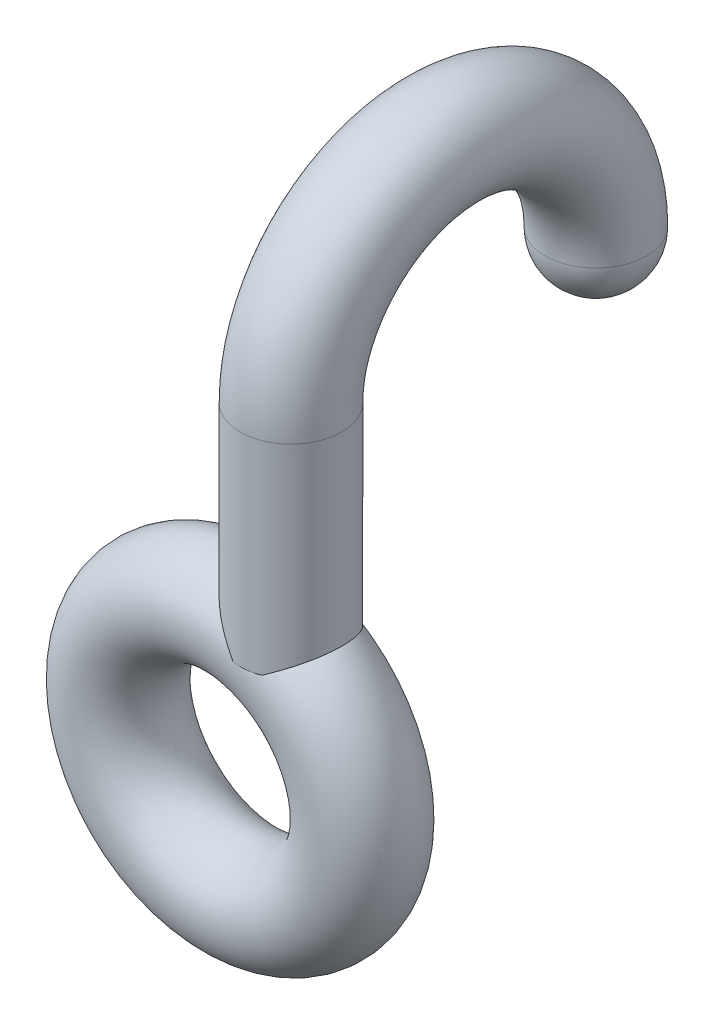
ISO-10303-21;
HEADER;
FILE_DESCRIPTION(('STEP AP214'),'2;1');
FILE_NAME('part.step','',(''),(''),'','','');
FILE_SCHEMA(('AUTOMOTIVE_DESIGN { 1 0 10303 214 1 1 1 1 }'));
ENDSEC;
DATA;
#1=APPLICATION_CONTEXT('core data for automotive mechanical design processes');
#2=APPLICATION_PROTOCOL_DEFINITION('international standard','automotive_design',2000,#1);
#3=PRODUCT_CONTEXT('',#1,'mechanical');
#4=PRODUCT('Part','Part','',(#3));
#5=PRODUCT_RELATED_PRODUCT_CATEGORY('part','',(#4));
#6=PRODUCT_DEFINITION_FORMATION('','',#4);
#7=PRODUCT_DEFINITION_CONTEXT('part definition',#1,'design');
#8=PRODUCT_DEFINITION('design','',#6,#7);
#9=PRODUCT_DEFINITION_SHAPE('','',#8);
#10=(LENGTH_UNIT() NAMED_UNIT(*) SI_UNIT(.MILLI.,.METRE.));
#11=(NAMED_UNIT(*) PLANE_ANGLE_UNIT() SI_UNIT($,.RADIAN.));
#12=(NAMED_UNIT(*) SI_UNIT($,.STERADIAN.) SOLID_ANGLE_UNIT());
#13=UNCERTAINTY_MEASURE_WITH_UNIT(LENGTH_MEASURE(1.E-05),#10,'distance_accuracy_value','');
#14=(GEOMETRIC_REPRESENTATION_CONTEXT(3) GLOBAL_UNCERTAINTY_ASSIGNED_CONTEXT((#13)) GLOBAL_UNIT_ASSIGNED_CONTEXT((#10,
#11,#12)) REPRESENTATION_CONTEXT('',''));
#15=CARTESIAN_POINT('',(0.,0.,0.));
#16=DIRECTION('',(0.,0.,1.));
#17=DIRECTION('',(1.,0.,0.));
#18=AXIS2_PLACEMENT_3D('',#15,#16,#17);
#19=CARTESIAN_POINT('',(24.9999999999999,60.,0.));
#20=DIRECTION('',(0.,1.,0.));
#21=DIRECTION('',(0.,0.,1.));
#22=AXIS2_PLACEMENT_3D('',#19,#20,#21);
#23=PLANE('',#22);
#24=CARTESIAN_POINT('',(60.2079728939615,60.,-3.08062058918245E-12));
#25=CARTESIAN_POINT('',(60.2079690010283,60.,0.543649915099497));
#26=CARTESIAN_POINT('',(60.1828972290788,60.,1.08734829242456));
#27=CARTESIAN_POINT('',(60.0830320047576,60.,2.17018519638416));
#28=CARTESIAN_POINT('',(60.0082326103515,60.,2.70932317029092));
#29=CARTESIAN_POINT('',(59.8101496311179,60.,3.7788189785286));
#30=CARTESIAN_POINT('',(59.6868468164569,60.,4.30917324342634));
#31=CARTESIAN_POINT('',(59.3937846964837,60.,5.35683802269299));
#32=CARTESIAN_POINT('',(59.2240261373832,60.,5.87414874643256));
#33=CARTESIAN_POINT('',(58.8416395886562,60.,6.8896816882122));
#34=CARTESIAN_POINT('',(58.6292295100772,60.,7.38798620353821));
#35=CARTESIAN_POINT('',(58.1640501686476,60.,8.36531848092582));
#36=CARTESIAN_POINT('',(57.9112817015036,60.,8.84434662280757));
#37=CARTESIAN_POINT('',(57.368571912829,60.,9.78103541093377));
#38=CARTESIAN_POINT('',(57.0786175326283,60.,10.238688473448));
#39=CARTESIAN_POINT('',(56.4649787515335,60.,11.1308403970052));
#40=CARTESIAN_POINT('',(56.1412870301002,60.,11.5653342017658));
#41=CARTESIAN_POINT('',(55.3542536357647,60.,12.5462321357457));
#42=CARTESIAN_POINT('',(54.879539755331,60.,13.0835398552556));
#43=CARTESIAN_POINT('',(53.8846406433541,60.,14.1142488483532));
#44=CARTESIAN_POINT('',(53.364442947367,60.,14.6076380112165));
#45=CARTESIAN_POINT('',(52.2853317406539,60.,15.5506216104007));
#46=CARTESIAN_POINT('',(51.7263939913783,60.,16.000188197136));
#47=CARTESIAN_POINT('',(50.5762293802615,60.,16.856132935662));
#48=CARTESIAN_POINT('',(49.9849931057637,60.,17.2624983947404));
#49=CARTESIAN_POINT('',(48.9416447820841,60.,17.9277476860102));
#50=CARTESIAN_POINT('',(48.4957928355327,60.,18.1965362472643));
#51=CARTESIAN_POINT('',(47.5920690502357,60.,18.7127435149086));
#52=CARTESIAN_POINT('',(47.1342000396965,60.,18.9601671917323));
#53=CARTESIAN_POINT('',(45.7442889976545,60.,19.6720445059469));
#54=CARTESIAN_POINT('',(44.7963487793184,60.,20.1058491312156));
#55=CARTESIAN_POINT('',(43.3511217284719,60.,20.7007423866919));
#56=CARTESIAN_POINT('',(42.8650140726124,60.,20.8898929648225));
#57=CARTESIAN_POINT('',(41.8862362098629,60.,21.250472991182));
#58=CARTESIAN_POINT('',(41.3935661107034,60.,21.4219027299164));
#59=CARTESIAN_POINT('',(40.4031114402192,60.,21.747885537034));
#60=CARTESIAN_POINT('',(39.9053309840656,60.,21.9024511727082));
#61=CARTESIAN_POINT('',(38.9051736115693,60.,22.1958501217992));
#62=CARTESIAN_POINT('',(38.4027966927243,60.,22.3346834266507));
#63=CARTESIAN_POINT('',(36.9891059245444,60.,22.7032174988927));
#64=CARTESIAN_POINT('',(36.0734403304823,60.,22.9163348410321));
#65=CARTESIAN_POINT('',(34.2332085626832,60.,23.30037198015));
#66=CARTESIAN_POINT('',(33.3086401850301,60.,23.4712810339477));
#67=CARTESIAN_POINT('',(31.4526132637234,60.,23.7765121196709));
#68=CARTESIAN_POINT('',(30.5211488474485,60.,23.9107980724302));
#69=CARTESIAN_POINT('',(28.6543471324009,60.,24.1478354998615));
#70=CARTESIAN_POINT('',(27.7190101113702,60.,24.2505891976295));
#71=CARTESIAN_POINT('',(25.8414167700126,60.,24.4300076608843));
#72=CARTESIAN_POINT('',(24.8991486503505,60.,24.5065466882867));
#73=CARTESIAN_POINT('',(23.0131038726389,60.,24.6376314910425));
#74=CARTESIAN_POINT('',(22.069327188425,60.,24.6921768806931));
#75=CARTESIAN_POINT('',(20.1813479095392,60.,24.7836834108007));
#76=CARTESIAN_POINT('',(19.2371456635149,60.,24.820651974168));
#77=CARTESIAN_POINT('',(17.3483336060155,60.,24.88108805285));
#78=CARTESIAN_POINT('',(16.4037237971897,60.,24.9045556546393));
#79=CARTESIAN_POINT('',(14.5048777064774,60.,24.941805171563));
#80=CARTESIAN_POINT('',(13.5506395971351,60.,24.9554879090588));
#81=CARTESIAN_POINT('',(11.642096763053,60.,24.9760326614332));
#82=CARTESIAN_POINT('',(10.6877920382904,60.,24.9828946739616));
#83=CARTESIAN_POINT('',(8.77912731811906,60.,24.9924895046191));
#84=CARTESIAN_POINT('',(7.82476732202034,60.,24.9952221587616));
#85=CARTESIAN_POINT('',(5.91604651071404,60.,24.9986286110287));
#86=CARTESIAN_POINT('',(4.96168569551064,60.,24.9993024126736));
#87=CARTESIAN_POINT('',(3.0553078415567,60.,24.9999820072962));
#88=CARTESIAN_POINT('',(2.1032908028552,60.,24.9999894367595));
#89=CARTESIAN_POINT('',(0.199256478190514,60.,25.0000056842297));
#90=CARTESIAN_POINT('',(-0.75276080777267,60.,25.0000145022369));
#91=CARTESIAN_POINT('',(-2.65677789235277,60.,24.9999620454954));
#92=CARTESIAN_POINT('',(-3.60877769096953,60.,24.9999007720348));
#93=CARTESIAN_POINT('',(-5.51277662016101,60.,24.9989008159513));
#94=CARTESIAN_POINT('',(-6.46477575073582,60.,24.9979621337961));
#95=CARTESIAN_POINT('',(-8.40813783072433,60.,24.9936071789942));
#96=CARTESIAN_POINT('',(-9.39950062340847,60.,24.9900900567972));
#97=CARTESIAN_POINT('',(-11.3822063888549,60.,24.9779945302659));
#98=CARTESIAN_POINT('',(-12.3735493614518,60.,24.9694160938516));
#99=CARTESIAN_POINT('',(-14.3568338699333,60.,24.9440084258309));
#100=CARTESIAN_POINT('',(-15.3487753385985,60.,24.9271734181176));
#101=CARTESIAN_POINT('',(-17.3323907696764,60.,24.8814344452431));
#102=CARTESIAN_POINT('',(-18.32406473363,60.,24.8525305511515));
#103=CARTESIAN_POINT('',(-20.3021328531856,60.,24.7784584784111));
#104=CARTESIAN_POINT('',(-21.288529793698,60.,24.7333678843973));
#105=CARTESIAN_POINT('',(-23.2601977866603,60.,24.6221097697654));
#106=CARTESIAN_POINT('',(-24.2454688059734,60.,24.5559416440741));
#107=CARTESIAN_POINT('',(-26.2134207783358,60.,24.3973514232587));
#108=CARTESIAN_POINT('',(-27.1961028299462,60.,24.3049433054597));
#109=CARTESIAN_POINT('',(-29.1579010385996,60.,24.0882713374375));
#110=CARTESIAN_POINT('',(-30.1370175420661,60.,23.9640106705027));
#111=CARTESIAN_POINT('',(-32.2414416379055,60.,23.655449062654));
#112=CARTESIAN_POINT('',(-33.3658435339781,60.,23.4648215100082));
#113=CARTESIAN_POINT('',(-35.603133803652,60.,23.0233791598699));
#114=CARTESIAN_POINT('',(-36.7160205136767,60.,22.7725557892235));
#115=CARTESIAN_POINT('',(-38.9242463836952,60.,22.2004724362846));
#116=CARTESIAN_POINT('',(-40.0195783741902,60.,21.8791844245626));
#117=CARTESIAN_POINT('',(-42.1832858981701,60.,21.1558716043157));
#118=CARTESIAN_POINT('',(-43.2516708442261,60.,20.7538754392944));
#119=CARTESIAN_POINT('',(-45.0610644582125,60.,19.9820697846019));
#120=CARTESIAN_POINT('',(-45.8112743655589,60.,19.63383214583));
#121=CARTESIAN_POINT('',(-47.2857377607353,60.,18.8858576912009));
#122=CARTESIAN_POINT('',(-48.0099908899032,60.,18.4861201640858));
#123=CARTESIAN_POINT('',(-49.4246850204828,60.,17.6324382852778));
#124=CARTESIAN_POINT('',(-50.1151744497794,60.,17.1785749868926));
#125=CARTESIAN_POINT('',(-51.1198969131018,60.,16.4551700874967));
#126=CARTESIAN_POINT('',(-51.4496106607652,60.,16.2069550145714));
#127=CARTESIAN_POINT('',(-52.0977294331049,60.,15.695994404981));
#128=CARTESIAN_POINT('',(-52.4161316811847,60.,15.4332453406277));
#129=CARTESIAN_POINT('',(-53.2009120821663,60.,14.7541569474351));
#130=CARTESIAN_POINT('',(-53.6591593537967,60.,14.3283348934131));
#131=CARTESIAN_POINT('',(-54.5419729243534,60.,13.4432499462893));
#132=CARTESIAN_POINT('',(-54.9665475656826,60.,12.9839953905164));
#133=CARTESIAN_POINT('',(-55.7772601263229,60.,12.0325115920145));
#134=CARTESIAN_POINT('',(-56.1633934500423,60.,11.5402784184896));
#135=CARTESIAN_POINT('',(-56.8919543790187,60.,10.524349664878));
#136=CARTESIAN_POINT('',(-57.2343812339712,60.,10.000653544897));
#137=CARTESIAN_POINT('',(-57.8733661338801,60.,8.91895173130708));
#138=CARTESIAN_POINT('',(-58.1694429543071,60.,8.36066063800138));
#139=CARTESIAN_POINT('',(-58.7064210458672,60.,7.21803221588193));
#140=CARTESIAN_POINT('',(-58.9473210387542,60.,6.63369428403234));
#141=CARTESIAN_POINT('',(-59.3690239134058,60.,5.44424681235844));
#142=CARTESIAN_POINT('',(-59.5498809857876,60.,4.8391565494394));
#143=CARTESIAN_POINT('',(-59.8479208108797,60.,3.61351370819286));
#144=CARTESIAN_POINT('',(-59.9651159086343,60.,2.99296415208905));
#145=CARTESIAN_POINT('',(-60.1204282925001,60.,1.8383611445967));
#146=CARTESIAN_POINT('',(-60.1678780811937,60.,1.30554550337087));
#147=CARTESIAN_POINT('',(-60.2144285770443,60.,0.237835174261451));
#148=CARTESIAN_POINT('',(-60.2135350473466,60.,-0.297059258201381));
#149=CARTESIAN_POINT('',(-60.1634240626036,60.,-1.36443240509149));
#150=CARTESIAN_POINT('',(-60.1142183932404,60.,-1.89691167686732));
#151=CARTESIAN_POINT('',(-59.9683216792539,60.,-2.95531345931883));
#152=CARTESIAN_POINT('',(-59.8716309654201,60.,-3.48123601564363));
#153=CARTESIAN_POINT('',(-59.6399663778161,60.,-4.48931301473558));
#154=CARTESIAN_POINT('',(-59.5078223913057,60.,-4.97212195634964));
#155=CARTESIAN_POINT('',(-59.2050921656265,60.,-5.92547948988712));
#156=CARTESIAN_POINT('',(-59.0345083122338,60.,-6.39602884068275));
#157=CARTESIAN_POINT('',(-58.6570980334831,60.,-7.3222517956829));
#158=CARTESIAN_POINT('',(-58.4502764015359,60.,-7.77792735789662));
#159=CARTESIAN_POINT('',(-58.0028224852538,60.,-8.67234997431195));
#160=CARTESIAN_POINT('',(-57.7621881996649,60.,-9.11109602455385));
#161=CARTESIAN_POINT('',(-57.2305847555072,60.,-10.002032236233));
#162=CARTESIAN_POINT('',(-56.9371985471357,60.,-10.4527791698914));
#163=CARTESIAN_POINT('',(-56.3177561292645,60.,-11.3311713760661));
#164=CARTESIAN_POINT('',(-55.9916992936585,60.,-11.7588162056073));
#165=CARTESIAN_POINT('',(-55.3099636477623,60.,-12.5903124190574));
#166=CARTESIAN_POINT('',(-54.9542620269908,60.,-12.99414506479));
#167=CARTESIAN_POINT('',(-54.2166276546821,60.,-13.7771552979386));
#168=CARTESIAN_POINT('',(-53.8346889617628,60.,-14.1563272628506));
#169=CARTESIAN_POINT('',(-52.8357428153287,60.,-15.0872526647483));
#170=CARTESIAN_POINT('',(-52.2028553263701,60.,-15.6220562445994));
#171=CARTESIAN_POINT('',(-50.8922627066958,60.,-16.6336530172359));
#172=CARTESIAN_POINT('',(-50.2145382820508,60.,-17.1104209826026));
#173=CARTESIAN_POINT('',(-48.8230219558628,60.,-18.0080696496724));
#174=CARTESIAN_POINT('',(-48.1092229819101,60.,-18.4289393333905));
#175=CARTESIAN_POINT('',(-46.6528400760921,60.,-19.2178458609577));
#176=CARTESIAN_POINT('',(-45.9102463324746,60.,-19.5858644914053));
#177=CARTESIAN_POINT('',(-44.5555506192186,60.,-20.2028463688866));
#178=CARTESIAN_POINT('',(-43.9475141717436,60.,-20.4608203630601));
#179=CARTESIAN_POINT('',(-42.719960186409,60.,-20.9472426391874));
#180=CARTESIAN_POINT('',(-42.10044508834,60.,-21.1756971150446));
#181=CARTESIAN_POINT('',(-40.2268852090911,60.,-21.8202007786249));
#182=CARTESIAN_POINT('',(-38.9584965460771,60.,-22.1950914522038));
#183=CARTESIAN_POINT('',(-37.0357109027834,60.,-22.6876728405938));
#184=CARTESIAN_POINT('',(-36.3898604185428,60.,-22.8405196598312));
#185=CARTESIAN_POINT('',(-35.0933691757634,60.,-23.1245672704176));
#186=CARTESIAN_POINT('',(-34.4427284271224,60.,-23.255768106479));
#187=CARTESIAN_POINT('',(-33.1382084810421,60.,-23.4983986464729));
#188=CARTESIAN_POINT('',(-32.4843314262078,60.,-23.6098399962942));
#189=CARTESIAN_POINT('',(-31.1738478803325,60.,-23.8149524187235));
#190=CARTESIAN_POINT('',(-30.5172415260465,60.,-23.9086243709782));
#191=CARTESIAN_POINT('',(-28.7739602710341,60.,-24.1358465551734));
#192=CARTESIAN_POINT('',(-27.6854926352757,60.,-24.2556763887041));
#193=CARTESIAN_POINT('',(-25.5051855706085,60.,-24.4598980955334));
#194=CARTESIAN_POINT('',(-24.4133456441123,60.,-24.5442844600939));
#195=CARTESIAN_POINT('',(-22.2271983014142,60.,-24.6849806038984));
#196=CARTESIAN_POINT('',(-21.1328897435309,60.,-24.7412721214788));
#197=CARTESIAN_POINT('',(-18.9434742343269,60.,-24.8324223584903));
#198=CARTESIAN_POINT('',(-17.8483673214175,60.,-24.8672820486732));
#199=CARTESIAN_POINT('',(-15.6549766027163,60.,-24.9216630019507));
#200=CARTESIAN_POINT('',(-14.5566918780374,60.,-24.9411445351304));
#201=CARTESIAN_POINT('',(-12.3599938912127,60.,-24.9698686411868));
#202=CARTESIAN_POINT('',(-11.2615806280198,60.,-24.9791111238659));
#203=CARTESIAN_POINT('',(-9.06513931117759,60.,-24.991660201204));
#204=CARTESIAN_POINT('',(-7.96711126775309,60.,-24.994969023411));
#205=CARTESIAN_POINT('',(-5.77105885611005,60.,-24.9988864623566));
#206=CARTESIAN_POINT('',(-4.67303448790724,60.,-24.99949509479));
#207=CARTESIAN_POINT('',(-2.4734464659565,60.,-25.0000528647828));
#208=CARTESIAN_POINT('',(-1.37188281242946,60.,-24.9999998702131));
#209=CARTESIAN_POINT('',(0.83124671155231,60.,-25.0000001149547));
#210=CARTESIAN_POINT('',(1.93281258200706,60.,-25.0000533544787));
#211=CARTESIAN_POINT('',(4.13618405764427,60.,-24.9997114162613));
#212=CARTESIAN_POINT('',(5.23798966283538,60.,-24.9993161409441));
#213=CARTESIAN_POINT('',(7.44159633048323,60.,-24.9962211056219));
#214=CARTESIAN_POINT('',(8.54339739294413,60.,-24.9935213519459));
#215=CARTESIAN_POINT('',(10.7451423734941,60.,-24.9827473670822));
#216=CARTESIAN_POINT('',(11.8450863261034,60.,-24.9746821013366));
#217=CARTESIAN_POINT('',(14.0449000787701,60.,-24.9490221187614));
#218=CARTESIAN_POINT('',(15.1447698768152,60.,-24.9314272041957));
#219=CARTESIAN_POINT('',(17.3438986542881,60.,-24.8815813529602));
#220=CARTESIAN_POINT('',(18.4431577184967,60.,-24.8493344179106));
#221=CARTESIAN_POINT('',(20.6408583335131,60.,-24.7642216149743));
#222=CARTESIAN_POINT('',(21.7392999317294,60.,-24.7113570543539));
#223=CARTESIAN_POINT('',(23.6264975198413,60.,-24.596969388468));
#224=CARTESIAN_POINT('',(24.4156488855412,60.,-24.54204012187));
#225=CARTESIAN_POINT('',(25.9926503487676,60.,-24.4153238848812));
#226=CARTESIAN_POINT('',(26.7805003936626,60.,-24.3435362486943));
#227=CARTESIAN_POINT('',(28.3545450413262,60.,-24.1802073586615));
#228=CARTESIAN_POINT('',(29.1407387047236,60.,-24.0886569411894));
#229=CARTESIAN_POINT('',(30.710159105209,60.,-23.8828084984347));
#230=CARTESIAN_POINT('',(31.4933858968435,60.,-23.7685108934529));
#231=CARTESIAN_POINT('',(33.0505339522837,60.,-23.5148500176459));
#232=CARTESIAN_POINT('',(33.8244825560573,60.,-23.3756560750247));
#233=CARTESIAN_POINT('',(35.3666395243493,60.,-23.0685068920988));
#234=CARTESIAN_POINT('',(36.1348482820002,60.,-22.9005536407708));
#235=CARTESIAN_POINT('',(37.6631199942575,60.,-22.5326817746683));
#236=CARTESIAN_POINT('',(38.4231877929487,60.,-22.3327834415483));
#237=CARTESIAN_POINT('',(39.9330490760643,60.,-21.8976099662698));
#238=CARTESIAN_POINT('',(40.6828440652459,60.,-21.6623400671039));
#239=CARTESIAN_POINT('',(42.2091598406763,60.,-21.1392966064873));
#240=CARTESIAN_POINT('',(42.9849564965717,60.,-20.8493834987605));
#241=CARTESIAN_POINT('',(44.1341309655001,60.,-20.3793164729341));
#242=CARTESIAN_POINT('',(44.5147626479101,60.,-20.2167643191617));
#243=CARTESIAN_POINT('',(45.2706808948779,60.,-19.8793899588721));
#244=CARTESIAN_POINT('',(45.6459658459183,60.,-19.7045641390038));
#245=CARTESIAN_POINT('',(46.7636062771351,60.,-19.1605401310145));
#246=CARTESIAN_POINT('',(47.4967865545668,60.,-18.7721845584726));
#247=CARTESIAN_POINT('',(48.9316072521155,60.,-17.9412383646235));
#248=CARTESIAN_POINT('',(49.6332571650906,60.,-17.4986642184861));
#249=CARTESIAN_POINT('',(50.8842843593789,60.,-16.6345142006184));
#250=CARTESIAN_POINT('',(51.4396351479361,60.,-16.2215998321492));
#251=CARTESIAN_POINT('',(52.5176614497382,60.,-15.3549869294815));
#252=CARTESIAN_POINT('',(53.0403372866841,60.,-14.9012887994242));
#253=CARTESIAN_POINT('',(54.0463672040336,60.,-13.953309038118));
#254=CARTESIAN_POINT('',(54.5297772797583,60.,-13.4590872929631));
#255=CARTESIAN_POINT('',(55.2208681800121,60.,-12.6875983595529));
#256=CARTESIAN_POINT('',(55.4455506105782,60.,-12.4254233477625));
#257=CARTESIAN_POINT('',(55.8828463067204,60.,-11.8910683115529));
#258=CARTESIAN_POINT('',(56.0954564322624,60.,-11.6188857141928));
#259=CARTESIAN_POINT('',(56.6322391379196,60.,-10.8973630233421));
#260=CARTESIAN_POINT('',(56.9462003597648,60.,-10.4403492574185));
#261=CARTESIAN_POINT('',(57.5368720402672,60.,-9.50296175144639));
#262=CARTESIAN_POINT('',(57.8135901798895,60.,-9.02259285603401));
#263=CARTESIAN_POINT('',(58.3261123980133,60.,-8.04082627134443));
#264=CARTESIAN_POINT('',(58.5619422030983,60.,-7.5394420531616));
#265=CARTESIAN_POINT('',(58.9894892999692,60.,-6.51819686658345));
#266=CARTESIAN_POINT('',(59.1812120235718,60.,-5.99833818244398));
#267=CARTESIAN_POINT('',(59.4901850501449,60.,-5.02953991003546));
#268=CARTESIAN_POINT('',(59.6144784990813,60.,-4.58283641042453));
#269=CARTESIAN_POINT('',(59.8286457495514,60.,-3.68127955976848));
#270=CARTESIAN_POINT('',(59.9185239514841,60.,-3.22642725843505));
#271=CARTESIAN_POINT('',(60.0627859782676,60.,-2.31109721955079));
#272=CARTESIAN_POINT('',(60.1171683723311,60.,-1.85061925599932));
#273=CARTESIAN_POINT('',(60.1897658151551,60.,-0.926772841507867));
#274=CARTESIAN_POINT('',(60.2079762122751,60.,-0.463404026495655));
#275=CARTESIAN_POINT('',(60.2079728939615,60.,-3.08062058918245E-12));
#276=B_SPLINE_CURVE_WITH_KNOTS('',3,(#24,#25,#26,#27,#28,#29,#30,#31,#32,#33,#34,#35,#36,#37,
#38,#39,#40,#41,#42,#43,#44,#45,#46,#47,#48,#49,#50,#51,#52,#53,#54,#55,#56,#57,#58,#59,#60,#61,
#62,#63,#64,#65,#66,#67,#68,#69,#70,#71,#72,#73,#74,#75,#76,#77,#78,#79,#80,#81,#82,#83,#84,#85,
#86,#87,#88,#89,#90,#91,#92,#93,#94,#95,#96,#97,#98,#99,#100,#101,#102,#103,#104,#105,#106,#107,
#108,#109,#110,#111,#112,#113,#114,#115,#116,#117,#118,#119,#120,#121,#122,#123,#124,#125,#126,
#127,#128,#129,#130,#131,#132,#133,#134,#135,#136,#137,#138,#139,#140,#141,#142,#143,#144,#145,
#146,#147,#148,#149,#150,#151,#152,#153,#154,#155,#156,#157,#158,#159,#160,#161,#162,#163,#164,
#165,#166,#167,#168,#169,#170,#171,#172,#173,#174,#175,#176,#177,#178,#179,#180,#181,#182,#183,
#184,#185,#186,#187,#188,#189,#190,#191,#192,#193,#194,#195,#196,#197,#198,#199,#200,#201,#202,
#203,#204,#205,#206,#207,#208,#209,#210,#211,#212,#213,#214,#215,#216,#217,#218,#219,#220,#221,
#222,#223,#224,#225,#226,#227,#228,#229,#230,#231,#232,#233,#234,#235,#236,#237,#238,#239,#240,
#241,#242,#243,#244,#245,#246,#247,#248,#249,#250,#251,#252,#253,#254,#255,#256,#257,#258,#259,
#260,#261,#262,#263,#264,#265,#266,#267,#268,#269,#270,#271,#272,#273,#274,#275),.UNSPECIFIED.,
.T.,.F.,(4,2,2,2,2,2,2,2,2,2,2,2,2,2,2,2,2,2,2,2,2,2,2,2,2,2,2,2,2,2,2,2,2,2,2,2,2,2,2,2,2,2,2,
2,2,2,2,2,2,2,2,2,2,2,2,2,2,2,2,2,2,2,2,2,2,2,2,2,2,2,2,2,2,2,2,2,2,2,2,2,2,2,2,2,2,2,2,2,2,2,2,
2,2,2,2,2,2,2,2,2,2,2,2,2,2,2,2,2,2,2,2,2,2,2,2,2,2,2,2,2,2,2,2,2,2,4),(0.,1.63046052301574,
3.26111590743373,4.89241843975127,6.52369477024134,8.14683961294284,9.76995245765057,
11.3936368637871,13.0176743235029,15.1654389538616,17.3137940162892,19.4635055935313,
21.6138470316185,23.1750823277044,24.7359534260813,27.859128788509,29.4237315062488,
30.9883085706986,32.5517116170314,34.1151155145429,36.9342762735086,39.7541538492942,
42.5767994679399,45.3992460378818,48.2350467994072,51.0708972902502,53.9055491003694,
56.7401827541207,59.6031554901548,62.4661292127106,65.329216627775,68.1922991473287,
71.0483502774386,73.9044021379447,76.7604015094146,79.6163993585782,82.5905000534159,
85.5646195991916,88.5408227447289,91.517008364648,94.4791152039436,97.4413070841461,
100.401924036273,103.362245224744,106.782205906182,110.202653951492,113.624465058544,
117.045063897137,119.524595699991,122.004161750995,124.480060209913,125.717811496576,
126.95586453967,128.830759028282,130.705187550737,132.579839889398,134.454524405689,
136.347538878135,138.240597200398,140.13194230378,142.022920514972,143.625583245888,
145.228054919213,146.830135768815,148.432205458188,149.932257850435,151.432217167332,
152.93197822426,154.431828084269,156.043695437684,157.655593687154,159.268743886449,
160.882260595353,163.364189410194,165.847193267423,168.330685819937,170.815032184329,
172.795728132847,174.776007806612,178.738761814172,180.729597971307,182.720430016068,
184.710084771126,186.699641005664,189.983983565163,193.268836399037,196.555821617062,
199.842657940542,203.137958359689,206.433287807443,209.727379900469,213.021452846592,
216.326143854415,219.630841482696,222.936258195879,226.241665831102,229.541564158789,
232.841530960581,236.140597048101,239.439453991417,241.812489184202,244.185618112229,
246.559849787745,248.934037598552,251.292652632142,253.65110461114,256.008065135217,
258.364676639825,260.847712349806,262.089187724318,263.33103013272,265.81781854653,
268.303853176042,270.378161922821,272.452450116783,274.523726329599,275.559259721741,
276.595061236178,278.256711431507,279.918018403388,281.578276271921,283.238329569004,
284.628067694296,286.017628065639,287.407244444793,288.797039514034),.UNSPECIFIED.);
#277=CARTESIAN_POINT('',(33.9285714285888,60.,23.3512443403898));
#278=VERTEX_POINT('',#277);
#279=CARTESIAN_POINT('',(21.3235294117461,60.,24.7281937070564));
#280=VERTEX_POINT('',#279);
#281=EDGE_CURVE('E11',#278,#280,#276,.T.);
#282=ORIENTED_EDGE('',*,*,#281,.F.);
#283=CARTESIAN_POINT('',(24.9999999999999,60.,0.));
#284=DIRECTION('',(0.,1.,0.));
#285=DIRECTION('',(0.,0.,1.));
#286=AXIS2_PLACEMENT_3D('',#283,#284,#285);
#287=CIRCLE('',#286,25.);
#288=EDGE_CURVE('E65',#280,#278,#287,.T.);
#289=ORIENTED_EDGE('',*,*,#288,.F.);
#290=EDGE_LOOP('',(#282,#289));
#291=FACE_BOUND('',#290,.T.);
#292=ADVANCED_FACE('F34',(#291),#23,.F.);
#293=CARTESIAN_POINT('',(24.9999999999999,160.,0.));
#294=DIRECTION('',(0.,-1.,0.));
#295=DIRECTION('',(0.,0.,-1.));
#296=AXIS2_PLACEMENT_3D('',#293,#294,#295);
#297=CYLINDRICAL_SURFACE('',#296,25.);
#298=CARTESIAN_POINT('',(33.9282285720004,59.9998,-23.3513754319979));
#299=CARTESIAN_POINT('',(34.2553632235109,60.1906297234755,-23.2262958890938));
#300=CARTESIAN_POINT('',(34.5808007218694,60.3795577634649,-23.0939887490703));
#301=CARTESIAN_POINT('',(35.2277498184854,60.7534149386377,-22.8148483686061));
#302=CARTESIAN_POINT('',(35.5492611530658,60.9383438058769,-22.6680141585045));
#303=CARTESIAN_POINT('',(36.5072829504464,61.4869377432021,-22.2055252889184));
#304=CARTESIAN_POINT('',(37.1370346356201,61.8442664865418,-21.8679782506413));
#305=CARTESIAN_POINT('',(38.3762039052783,62.5416386629105,-21.132890057877));
#306=CARTESIAN_POINT('',(38.985493562716,62.8815785230921,-20.7350352779025));
#307=CARTESIAN_POINT('',(40.1744057687682,63.5398828922571,-19.8814671691917));
#308=CARTESIAN_POINT('',(40.7540336087855,63.8582512527096,-19.4257642108926));
#309=CARTESIAN_POINT('',(41.8799806527661,64.4724231720909,-18.4559084289626));
#310=CARTESIAN_POINT('',(42.4261557481911,64.7681303192187,-17.9415267886355));
#311=CARTESIAN_POINT('',(43.4763932529028,65.3332027260559,-16.8579987141134));
#312=CARTESIAN_POINT('',(43.9804525131179,65.6025660162473,-16.2888481915913));
#313=CARTESIAN_POINT('',(44.938909972638,66.1119386832895,-15.1003733174079));
#314=CARTESIAN_POINT('',(45.3934213339528,66.3520151041994,-14.4811691708095));
#315=CARTESIAN_POINT('',(46.247830754875,66.8011872322286,-13.1956464794029));
#316=CARTESIAN_POINT('',(46.6477368079773,67.010287474232,-12.5293348522279));
#317=CARTESIAN_POINT('',(47.3489087828381,67.3754661400584,-11.225698472859));
#318=CARTESIAN_POINT('',(47.6560922999508,67.5347876289043,-10.5924587390924));
#319=CARTESIAN_POINT('',(48.2178280485093,67.8252834732696,-9.29682058114504));
#320=CARTESIAN_POINT('',(48.4723833850655,67.9564594894148,-8.63442388005061));
#321=CARTESIAN_POINT('',(48.9253963623348,68.1893783633643,-7.28570410360011));
#322=CARTESIAN_POINT('',(49.1238557937271,68.2911221606989,-6.59938179277707));
#323=CARTESIAN_POINT('',(49.461851074011,68.4641298829113,-5.20862770006679));
#324=CARTESIAN_POINT('',(49.6013916600665,68.5353962582255,-4.50419737892403));
#325=CARTESIAN_POINT('',(49.8089222143957,68.6412926393166,-3.15254598074605));
#326=CARTESIAN_POINT('',(49.8825422094293,68.6788071374978,-2.50640815742861));
#327=CARTESIAN_POINT('',(49.9791937993455,68.728045097864,-1.20940698923068));
#328=CARTESIAN_POINT('',(50.0022292805835,68.7397705413953,-0.55854401123402));
#329=CARTESIAN_POINT('',(49.9974316114113,68.737327641835,0.742692656791506));
#330=CARTESIAN_POINT('',(49.9696176598974,68.7231690716055,1.39306643877456));
#331=CARTESIAN_POINT('',(49.8635036423406,68.669105028239,2.68860249397932));
#332=CARTESIAN_POINT('',(49.7852037890038,68.6291996635779,3.33376478914635));
#333=CARTESIAN_POINT('',(49.5827330868163,68.5258628281525,4.59134285856315));
#334=CARTESIAN_POINT('',(49.4602833268315,68.4633137451848,5.2041095858519));
#335=CARTESIAN_POINT('',(49.1706808830167,68.3151019108796,6.41610211709299));
#336=CARTESIAN_POINT('',(49.0035297206978,68.2294399462394,7.01532838117227));
#337=CARTESIAN_POINT('',(48.6263281722736,68.0356696930792,8.19639857854543));
#338=CARTESIAN_POINT('',(48.4162762794457,67.9275606161888,8.77824190050767));
#339=CARTESIAN_POINT('',(47.9554646584566,67.6897086798317,9.92099985924805));
#340=CARTESIAN_POINT('',(47.7047037823534,67.5599652102997,10.4819139052984));
#341=CARTESIAN_POINT('',(47.1572749737624,67.2757757540489,11.5952952837905));
#342=CARTESIAN_POINT('',(46.8595024239135,67.1207311588615,12.1470663505067));
#343=CARTESIAN_POINT('',(46.2265070041516,66.7898409403255,13.2221234585104));
#344=CARTESIAN_POINT('',(45.891283559358,66.6139949976686,13.7454090623556));
#345=CARTESIAN_POINT('',(45.1864439989997,66.2426264347206,14.7610866653244));
#346=CARTESIAN_POINT('',(44.8168193710535,66.0470989433586,15.253470967358));
#347=CARTESIAN_POINT('',(44.0464952986237,65.6376156356511,16.2051172541075));
#348=CARTESIAN_POINT('',(43.6457951832944,65.4236594214622,16.6643785233627));
#349=CARTESIAN_POINT('',(42.7832646128611,64.9606520918399,17.5836282307445));
#350=CARTESIAN_POINT('',(42.319109241542,64.7101624423627,18.0407114518373));
#351=CARTESIAN_POINT('',(41.3624044956906,64.1906208105443,18.9127137261828));
#352=CARTESIAN_POINT('',(40.8698517034543,63.9215665931386,19.3276276875824));
#353=CARTESIAN_POINT('',(39.8604139783553,63.3664422507992,20.1141112589359));
#354=CARTESIAN_POINT('',(39.3435297914931,63.0803726474863,20.4856821965735));
#355=CARTESIAN_POINT('',(38.2894060337568,62.4927575019619,21.184701263243));
#356=CARTESIAN_POINT('',(37.7521716702872,62.1912159119662,21.5121605835712));
#357=CARTESIAN_POINT('',(36.673323321035,61.5810319948522,22.1157593551211));
#358=CARTESIAN_POINT('',(36.1320862759254,61.2727067356775,22.3928959067622));
#359=CARTESIAN_POINT('',(35.0382144876219,60.6446509499699,22.9041058337604));
#360=CARTESIAN_POINT('',(34.485612884092,60.3249520212424,23.1382888513038));
#361=CARTESIAN_POINT('',(33.9282285719991,59.9998,23.3513754319984));
#362=B_SPLINE_CURVE_WITH_KNOTS('',3,(#298,#299,#300,#301,#302,#303,#304,#305,#306,#307,#308,
#309,#310,#311,#312,#313,#314,#315,#316,#317,#318,#319,#320,#321,#322,#323,#324,#325,#326,#327,
#328,#329,#330,#331,#332,#333,#334,#335,#336,#337,#338,#339,#340,#341,#342,#343,#344,#345,#346,
#347,#348,#349,#350,#351,#352,#353,#354,#355,#356,#357,#358,#359,#360,#361),.UNSPECIFIED.,.F.,
.F.,(4,2,2,2,2,2,2,2,2,2,2,2,2,2,2,2,2,2,2,2,2,2,2,2,2,2,2,2,2,2,2,4),(0.,1.19638767685955,
2.39285526480496,4.78668914903303,7.19342850165406,9.59973700604884,12.0157721392933,
14.4319877621665,16.8425639896262,19.2527869614353,21.4147176479025,23.5765207420659,
25.7382548199064,27.8998150579604,29.8515798048961,31.803194594531,33.754072677577,
35.7049425412788,37.5867844955461,39.4685624053048,41.3504064166122,43.2323035027614,
45.1678314875721,47.1033891873029,49.0394271098751,50.9755068385353,53.0671134253342,
55.1589722701009,57.2507670201953,59.3420300699425,61.3857711883944,63.4242206070892),.UNSPECIFIED.);
#363=CARTESIAN_POINT('',(33.9285714285717,60.,-23.3512443403963));
#364=VERTEX_POINT('',#363);
#365=EDGE_CURVE('E43',#364,#278,#362,.T.);
#366=ORIENTED_EDGE('',*,*,#365,.F.);
#367=CARTESIAN_POINT('',(21.3235294117481,60.,-24.7281937070567));
#368=VERTEX_POINT('',#367);
#369=EDGE_CURVE('E51',#364,#368,#287,.T.);
#370=ORIENTED_EDGE('',*,*,#369,.T.);
#371=CARTESIAN_POINT('',(21.3236705880008,59.9998,24.7282146960606));
#372=CARTESIAN_POINT('',(20.8903302144138,60.6137160624502,24.6637735113148));
#373=CARTESIAN_POINT('',(20.4531029075612,61.2236863018937,24.5871429855137));
#374=CARTESIAN_POINT('',(19.5719131728617,62.4350963729677,24.4077516051943));
#375=CARTESIAN_POINT('',(19.127948980255,63.0365338866934,24.304983788763));
#376=CARTESIAN_POINT('',(18.2327149179737,64.2323715125905,24.0711176042752));
#377=CARTESIAN_POINT('',(17.7814224748391,64.8267323884128,23.9399041826668));
#378=CARTESIAN_POINT('',(16.8747519197621,66.0048414226389,23.647562820625));
#379=CARTESIAN_POINT('',(16.4193741287751,66.588590404023,23.4864372109203));
#380=CARTESIAN_POINT('',(15.4993470795859,67.7528955983788,23.129733903509));
#381=CARTESIAN_POINT('',(15.0346601171381,68.3332778301351,22.9336832582914));
#382=CARTESIAN_POINT('',(14.1046252547402,69.48052036719,22.5067237073715));
#383=CARTESIAN_POINT('',(13.6392773989914,70.0473815354736,22.2758170332947));
#384=CARTESIAN_POINT('',(12.7109087764182,71.1650000085232,21.7774042662068));
#385=CARTESIAN_POINT('',(12.2478854076468,71.7157828768706,21.509960598942));
#386=CARTESIAN_POINT('',(11.3260812468419,72.8001378291306,20.9360611420247));
#387=CARTESIAN_POINT('',(10.867299517346,73.333713784177,20.6296142049859));
#388=CARTESIAN_POINT('',(9.94739120903741,74.392401952248,19.9686352499719));
#389=CARTESIAN_POINT('',(9.48641579018878,74.9171046279472,19.6132326017151));
#390=CARTESIAN_POINT('',(8.57572665868807,75.9433327553822,18.8571879191006));
#391=CARTESIAN_POINT('',(8.1260134872417,76.4448570942617,18.4565437157437));
#392=CARTESIAN_POINT('',(7.24396930202348,77.419387797607,17.6095333445633));
#393=CARTESIAN_POINT('',(6.81157793392202,77.8924966976254,17.163349491721));
#394=CARTESIAN_POINT('',(6.17873532689303,78.5790523530436,16.4578183820274));
#395=CARTESIAN_POINT('',(5.97042227470864,78.8040418715603,16.2166122578231));
#396=CARTESIAN_POINT('',(5.55966823496653,79.2458528664808,15.7218608399428));
#397=CARTESIAN_POINT('',(5.35722878012757,79.4626722152059,15.4683123709322));
#398=CARTESIAN_POINT('',(4.82659592939123,80.0287679652534,14.7760181899512));
#399=CARTESIAN_POINT('',(4.50430694540467,80.3702377697237,14.3262491939103));
#400=CARTESIAN_POINT('',(3.88226482845418,81.0254424601604,13.3923833715056));
#401=CARTESIAN_POINT('',(3.58250644404091,81.3391838121125,12.9082945958586));
#402=CARTESIAN_POINT('',(3.00973383246133,81.9355487890713,11.9063461594862));
#403=CARTESIAN_POINT('',(2.73671423035238,82.2181786694264,11.3884933209093));
#404=CARTESIAN_POINT('',(2.22193655089932,82.7486626483778,10.320418688525));
#405=CARTESIAN_POINT('',(1.98017247082373,82.9965234252812,9.77020313970999));
#406=CARTESIAN_POINT('',(1.57255675235212,83.4128324501755,8.74095004564964));
#407=CARTESIAN_POINT('',(1.40085946878249,83.5875570544798,8.26675728836608));
#408=CARTESIAN_POINT('',(1.08421544381515,83.9089340422441,7.30025571862326));
#409=CARTESIAN_POINT('',(0.939265846394646,84.0555894228982,6.80794884706529));
#410=CARTESIAN_POINT('',(0.678538159447818,84.3188345196749,5.80803747428077));
#411=CARTESIAN_POINT('',(0.562746358791476,84.4354383678047,5.30044028935462));
#412=CARTESIAN_POINT('',(0.362301303923451,84.6369833771419,4.27291090512217));
#413=CARTESIAN_POINT('',(0.277648504624435,84.7219240757797,3.75297852572794));
#414=CARTESIAN_POINT('',(0.140808756047289,84.8591023735899,2.70230026895647));
#415=CARTESIAN_POINT('',(0.0887600928783183,84.9112006819755,2.17151806182436));
#416=CARTESIAN_POINT('',(0.0187409644734607,84.9812642496156,1.10545451326008));
#417=CARTESIAN_POINT('',(0.000770600385801013,84.9992294075592,0.570173158478666));
#418=CARTESIAN_POINT('',(-0.000721987436327634,85.0007219794847,-0.500450188106477));
#419=CARTESIAN_POINT('',(0.0157536541772216,84.9842515274744,-1.03579217409702));
#420=CARTESIAN_POINT('',(0.0828107100787294,84.917155518489,-2.10215643817148));
#421=CARTESIAN_POINT('',(0.133390791971061,84.8665312958368,-2.63317888419141));
#422=CARTESIAN_POINT('',(0.263137210930844,84.7364772416379,-3.6514702039848));
#423=CARTESIAN_POINT('',(0.340166265948644,84.6591995548072,-4.13929071133104));
#424=CARTESIAN_POINT('',(0.521725500541261,84.4767126560595,-5.10442711392172));
#425=CARTESIAN_POINT('',(0.626254150339967,84.3715049978571,-5.58174359189519));
#426=CARTESIAN_POINT('',(0.861171642771909,84.1345044805586,-6.5232200108968));
#427=CARTESIAN_POINT('',(0.991561796566062,84.0027102735366,-6.98737928349922));
#428=CARTESIAN_POINT('',(1.27629922134377,83.7140964391861,-7.90029710335155));
#429=CARTESIAN_POINT('',(1.43064787166783,83.5572753709946,-8.34905476208096));
#430=CARTESIAN_POINT('',(1.77263553533441,83.208679710486,-9.25970340559049));
#431=CARTESIAN_POINT('',(1.96183520933091,83.0152416379842,-9.72037022506291));
#432=CARTESIAN_POINT('',(2.36265930599065,82.6038148283319,-10.6204311043225));
#433=CARTESIAN_POINT('',(2.57428407753265,82.3858257092249,-11.0598248329982));
#434=CARTESIAN_POINT('',(3.01745987834648,81.9273114865292,-11.9163975537668));
#435=CARTESIAN_POINT('',(3.2490169923152,81.6867794993315,-12.3335696989688));
#436=CARTESIAN_POINT('',(3.7295493302792,81.1852176344323,-13.14497508646));
#437=CARTESIAN_POINT('',(3.97852833335435,80.9241833079399,-13.5392033176733));
#438=CARTESIAN_POINT('',(4.63131971398387,80.2362124649847,-14.5128586950602));
#439=CARTESIAN_POINT('',(5.04560731860046,79.7963481680735,-15.0762159876062));
#440=CARTESIAN_POINT('',(5.90234922350616,78.8784600901715,-16.1477796263837));
#441=CARTESIAN_POINT('',(6.34481551972924,78.4004200351106,-16.6559622318481));
#442=CARTESIAN_POINT('',(7.2519697837744,77.4106610773967,-17.6194803088644));
#443=CARTESIAN_POINT('',(7.71670093189535,76.8988759418626,-18.0747066923854));
#444=CARTESIAN_POINT('',(8.66167450258843,75.8471628030681,-18.9332162644252));
#445=CARTESIAN_POINT('',(9.14191664481353,75.3072353083469,-19.3365003910966));
#446=CARTESIAN_POINT('',(10.3341487200093,73.9516014591641,-20.2661268270223));
#447=CARTESIAN_POINT('',(11.0521348651843,73.1222224644588,-20.7649387463046));
#448=CARTESIAN_POINT('',(12.4984596712508,71.4211892110297,-21.6665230599699));
#449=CARTESIAN_POINT('',(13.2268036663701,70.5495125675162,-22.0692439189725));
#450=CARTESIAN_POINT('',(14.6845676807388,68.7707434706061,-22.7871099731308));
#451=CARTESIAN_POINT('',(15.4139880964009,67.863624065295,-23.1021869822136));
#452=CARTESIAN_POINT('',(16.8655189395153,66.0205333544711,-23.6523222038181));
#453=CARTESIAN_POINT('',(17.5876319413592,65.0845727156598,-23.8874096215238));
#454=CARTESIAN_POINT('',(18.8154600066831,63.4573315687586,-24.2287890507157));
#455=CARTESIAN_POINT('',(19.3243819820367,62.7720636387609,-24.3526975667528));
#456=CARTESIAN_POINT('',(20.3317454580878,61.3928133325846,-24.5656457018035));
#457=CARTESIAN_POINT('',(20.8302209756117,60.6988773074608,-24.6548240737596));
#458=CARTESIAN_POINT('',(21.3236705879992,59.9998,-24.7282146960604));
#459=B_SPLINE_CURVE_WITH_KNOTS('',3,(#371,#372,#373,#374,#375,#376,#377,#378,#379,#380,#381,
#382,#383,#384,#385,#386,#387,#388,#389,#390,#391,#392,#393,#394,#395,#396,#397,#398,#399,#400,
#401,#402,#403,#404,#405,#406,#407,#408,#409,#410,#411,#412,#413,#414,#415,#416,#417,#418,#419,
#420,#421,#422,#423,#424,#425,#426,#427,#428,#429,#430,#431,#432,#433,#434,#435,#436,#437,#438,
#439,#440,#441,#442,#443,#444,#445,#446,#447,#448,#449,#450,#451,#452,#453,#454,#455,#456,#457,
#458),.UNSPECIFIED.,.F.,.F.,(4,2,2,2,2,2,2,2,2,2,2,2,2,2,2,2,2,2,2,2,2,2,2,2,2,2,2,2,2,2,2,2,2,
2,2,2,2,2,2,2,2,2,2,4),(0.,2.26259813298328,4.52579956254774,6.79833164875793,9.07068673572678,
11.3765463673457,13.6822584309614,15.9840791931609,18.2853784372288,20.6347429496182,
22.9842201445855,25.3246351556601,26.4947211385524,27.6651097589273,29.613863861396,
31.5621623290963,33.5100683488805,35.4575997090408,37.0572021613568,38.6566337148554,
40.2553117429831,41.8540131254245,43.4594500752644,45.0648917902143,46.6702340173517,
48.2755135304548,49.7734686449547,51.2713404472605,52.7692882100835,54.2673222448844,
55.8685309731535,57.4697646159081,59.0714888086316,60.6735615238957,63.1481582218691,
65.6238155134795,68.1044855024273,70.5851106805977,74.1947453267828,77.8063115559252,
81.4206797400662,85.0337268542873,87.6205314351282,90.1968925826961),.UNSPECIFIED.);
#460=EDGE_CURVE('E58',#280,#368,#459,.T.);
#461=ORIENTED_EDGE('',*,*,#460,.F.);
#462=ORIENTED_EDGE('',*,*,#288,.T.);
#463=EDGE_LOOP('',(#366,#370,#461,#462));
#464=FACE_BOUND('',#463,.T.);
#465=CARTESIAN_POINT('',(24.9999999999999,160.,0.));
#466=DIRECTION('',(0.,1.,0.));
#467=DIRECTION('',(0.,0.,1.));
#468=AXIS2_PLACEMENT_3D('',#465,#466,#467);
#469=CIRCLE('',#468,25.);
#470=CARTESIAN_POINT('',(24.9999999999999,160.,25.));
#471=VERTEX_POINT('',#470);
#472=EDGE_CURVE('E93',#471,#471,#469,.T.);
#473=ORIENTED_EDGE('',*,*,#472,.F.);
#474=EDGE_LOOP('',(#473));
#475=FACE_BOUND('',#474,.T.);
#476=ADVANCED_FACE('F68',(#464,#475),#297,.T.);
#477=EDGE_CURVE('E45',#368,#364,#276,.T.);
#478=ORIENTED_EDGE('',*,*,#477,.F.);
#479=ORIENTED_EDGE('',*,*,#369,.F.);
#480=EDGE_LOOP('',(#478,#479));
#481=FACE_BOUND('',#480,.T.);
#482=ADVANCED_FACE('F85',(#481),#23,.F.);
#483=CARTESIAN_POINT('',(0.,0.,2.22044604925031E-13));
#484=DIRECTION('',(0.,0.,1.));
#485=DIRECTION('',(1.,0.,0.));
#486=AXIS2_PLACEMENT_3D('',#483,#484,#485);
#487=TOROIDAL_SURFACE('',#486,60.,25.);
#488=ORIENTED_EDGE('',*,*,#365,.T.);
#489=ORIENTED_EDGE('',*,*,#281,.T.);
#490=ORIENTED_EDGE('',*,*,#460,.T.);
#491=ORIENTED_EDGE('',*,*,#477,.T.);
#492=EDGE_LOOP('',(#488,#489,#490,#491));
#493=FACE_BOUND('',#492,.T.);
#494=ADVANCED_FACE('F72',(#493),#487,.T.);
#495=CARTESIAN_POINT('',(24.9999999999999,160.,-75.));
#496=DIRECTION('',(1.,0.,0.));
#497=DIRECTION('',(0.,0.,-1.));
#498=AXIS2_PLACEMENT_3D('',#495,#496,#497);
#499=TOROIDAL_SURFACE('',#498,75.,25.);
#500=CARTESIAN_POINT('',(24.9999999999999,160.,-150.));
#501=DIRECTION('',(0.,-1.,0.));
#502=DIRECTION('',(0.,0.,-1.));
#503=AXIS2_PLACEMENT_3D('',#500,#501,#502);
#504=CIRCLE('',#503,25.);
#505=CARTESIAN_POINT('',(24.9999999999999,159.999999999999,-175.));
#506=VERTEX_POINT('',#505);
#507=EDGE_CURVE('E38',#506,#506,#504,.T.);
#508=CARTESIAN_POINT('',(24.9999999999999,160.,-75.));
#509=DIRECTION('',(1.,0.,0.));
#510=DIRECTION('',(0.,0.,-1.));
#511=AXIS2_PLACEMENT_3D('',#508,#509,#510);
#512=CIRCLE('',#511,100.);
#513=EDGE_CURVE('',#506,#471,#512,.T.);
#514=ORIENTED_EDGE('',*,*,#507,.F.);
#515=ORIENTED_EDGE('',*,*,#472,.T.);
#516=ORIENTED_EDGE('',*,*,#513,.T.);
#517=ORIENTED_EDGE('',*,*,#513,.F.);
#518=EDGE_LOOP('',(#514,#516,#515,#517));
#519=FACE_BOUND('',#518,.T.);
#520=ADVANCED_FACE('F90',(#519),#499,.T.);
#521=CARTESIAN_POINT('',(24.9999999999999,160.,-150.));
#522=DIRECTION('',(0.,0.,1.));
#523=DIRECTION('',(1.,0.,0.));
#524=AXIS2_PLACEMENT_3D('',#521,#522,#523);
#525=SPHERICAL_SURFACE('',#524,25.);
#526=CARTESIAN_POINT('',(24.9999999999999,160.,-150.));
#527=DIRECTION('',(0.,-1.,0.));
#528=DIRECTION('',(0.,0.,-1.));
#529=AXIS2_PLACEMENT_3D('',#526,#527,#528);
#530=SPHERICAL_SURFACE('',#529,25.);
#531=ORIENTED_EDGE('',*,*,#507,.T.);
#532=EDGE_LOOP('',(#531));
#533=FACE_BOUND('',#532,.T.);
#534=ADVANCED_FACE('F36',(#533),#530,.T.);
#535=CLOSED_SHELL('',(#292,#476,#482,#494,#520,#534));
#536=MANIFOLD_SOLID_BREP('B2',#535);
#537=ADVANCED_BREP_SHAPE_REPRESENTATION('',(#18,#536),#14);
#538=SHAPE_DEFINITION_REPRESENTATION(#9,#537);
ENDSEC;
END-ISO-10303-21;
